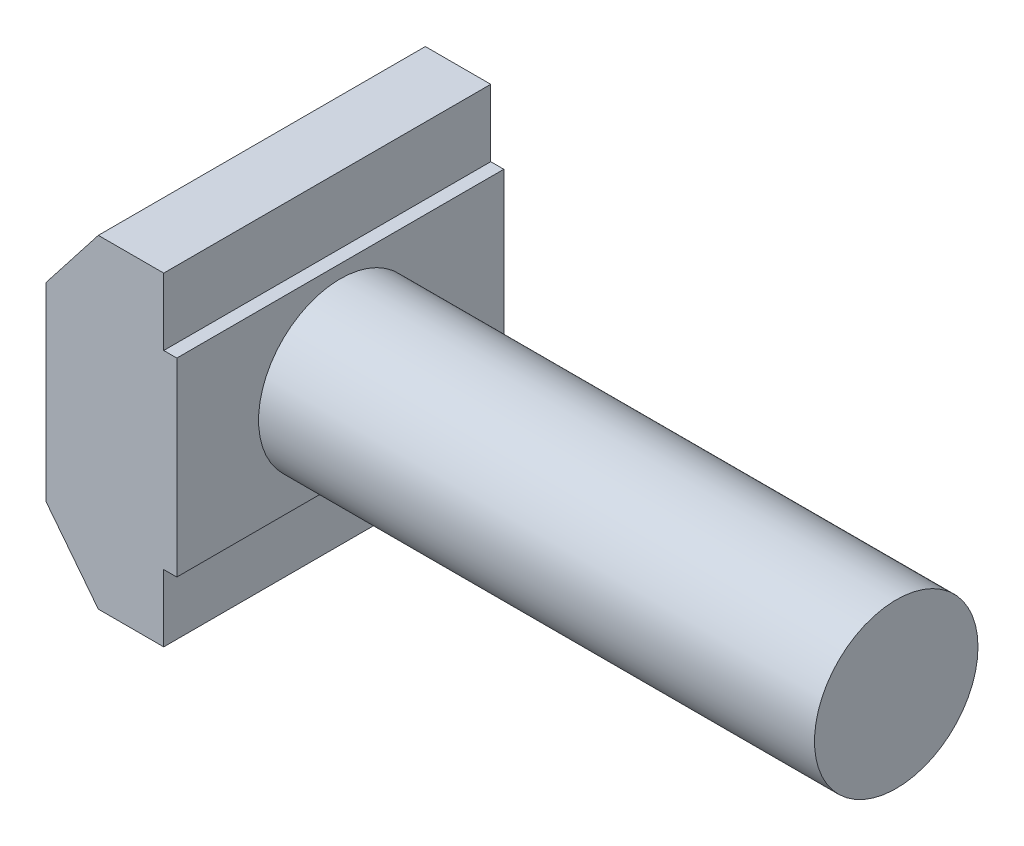
ISO-10303-21;
HEADER;
FILE_DESCRIPTION(('STEP AP214'),'2;1');
FILE_NAME('part.step','',(''),(''),'','','');
FILE_SCHEMA(('AUTOMOTIVE_DESIGN { 1 0 10303 214 1 1 1 1 }'));
ENDSEC;
DATA;
#1=APPLICATION_CONTEXT('core data for automotive mechanical design processes');
#2=APPLICATION_PROTOCOL_DEFINITION('international standard','automotive_design',2000,#1);
#3=PRODUCT_CONTEXT('',#1,'mechanical');
#4=PRODUCT('Part','Part','',(#3));
#5=PRODUCT_RELATED_PRODUCT_CATEGORY('part','',(#4));
#6=PRODUCT_DEFINITION_FORMATION('','',#4);
#7=PRODUCT_DEFINITION_CONTEXT('part definition',#1,'design');
#8=PRODUCT_DEFINITION('design','',#6,#7);
#9=PRODUCT_DEFINITION_SHAPE('','',#8);
#10=(LENGTH_UNIT() NAMED_UNIT(*) SI_UNIT(.MILLI.,.METRE.));
#11=(NAMED_UNIT(*) PLANE_ANGLE_UNIT() SI_UNIT($,.RADIAN.));
#12=(NAMED_UNIT(*) SI_UNIT($,.STERADIAN.) SOLID_ANGLE_UNIT());
#13=UNCERTAINTY_MEASURE_WITH_UNIT(LENGTH_MEASURE(1.E-05),#10,'distance_accuracy_value','');
#14=(GEOMETRIC_REPRESENTATION_CONTEXT(3) GLOBAL_UNCERTAINTY_ASSIGNED_CONTEXT((#13)) GLOBAL_UNIT_ASSIGNED_CONTEXT((#10,
#11,#12)) REPRESENTATION_CONTEXT('',''));
#15=CARTESIAN_POINT('',(0.,0.,0.));
#16=DIRECTION('',(0.,0.,1.));
#17=DIRECTION('',(1.,0.,0.));
#18=AXIS2_PLACEMENT_3D('',#15,#16,#17);
#19=CARTESIAN_POINT('',(0.,2.9,5.));
#20=DIRECTION('',(0.,-1.,0.));
#21=DIRECTION('',(0.,0.,-1.));
#22=AXIS2_PLACEMENT_3D('',#19,#20,#21);
#23=PLANE('',#22);
#24=DIRECTION('',(-1.,0.,0.));
#25=VECTOR('',#24,1.);
#26=CARTESIAN_POINT('',(0.,2.9,-5.));
#27=LINE('',#26,#25);
#28=CARTESIAN_POINT('',(0.,2.9,-5.));
#29=VERTEX_POINT('',#28);
#30=CARTESIAN_POINT('',(-0.400000000000023,2.9,-5.));
#31=VERTEX_POINT('',#30);
#32=EDGE_CURVE('E187',#29,#31,#27,.T.);
#33=ORIENTED_EDGE('',*,*,#32,.T.);
#34=DIRECTION('',(0.,0.,-1.));
#35=VECTOR('',#34,1.);
#36=CARTESIAN_POINT('',(-0.400000000000023,2.9,5.));
#37=LINE('',#36,#35);
#38=CARTESIAN_POINT('',(-0.400000000000023,2.9,5.));
#39=VERTEX_POINT('',#38);
#40=EDGE_CURVE('E55',#39,#31,#37,.T.);
#41=ORIENTED_EDGE('',*,*,#40,.F.);
#42=DIRECTION('',(-1.,0.,0.));
#43=VECTOR('',#42,1.);
#44=CARTESIAN_POINT('',(0.,2.9,5.));
#45=LINE('',#44,#43);
#46=CARTESIAN_POINT('',(0.,2.9,5.));
#47=VERTEX_POINT('',#46);
#48=EDGE_CURVE('E216',#47,#39,#45,.T.);
#49=ORIENTED_EDGE('',*,*,#48,.F.);
#50=DIRECTION('',(0.,0.,-1.));
#51=VECTOR('',#50,1.);
#52=CARTESIAN_POINT('',(0.,2.9,5.));
#53=LINE('',#52,#51);
#54=EDGE_CURVE('E183',#47,#29,#53,.T.);
#55=ORIENTED_EDGE('',*,*,#54,.T.);
#56=EDGE_LOOP('',(#33,#41,#49,#55));
#57=FACE_BOUND('',#56,.T.);
#58=ADVANCED_FACE('F52',(#57),#23,.F.);
#59=CARTESIAN_POINT('',(-0.400000000000023,2.9,5.));
#60=DIRECTION('',(-1.,0.,0.));
#61=DIRECTION('',(0.,-1.,0.));
#62=AXIS2_PLACEMENT_3D('',#59,#60,#61);
#63=PLANE('',#62);
#64=DIRECTION('',(0.,1.,0.));
#65=VECTOR('',#64,1.);
#66=CARTESIAN_POINT('',(-0.400000000000023,2.9,-5.));
#67=LINE('',#66,#65);
#68=CARTESIAN_POINT('',(-0.400000000000023,4.95,-5.));
#69=VERTEX_POINT('',#68);
#70=EDGE_CURVE('E191',#31,#69,#67,.T.);
#71=ORIENTED_EDGE('',*,*,#70,.T.);
#72=DIRECTION('',(0.,0.,-1.));
#73=VECTOR('',#72,1.);
#74=CARTESIAN_POINT('',(-0.400000000000023,4.95,5.));
#75=LINE('',#74,#73);
#76=CARTESIAN_POINT('',(-0.400000000000023,4.95,5.));
#77=VERTEX_POINT('',#76);
#78=EDGE_CURVE('E238',#77,#69,#75,.T.);
#79=ORIENTED_EDGE('',*,*,#78,.F.);
#80=DIRECTION('',(0.,1.,0.));
#81=VECTOR('',#80,1.);
#82=CARTESIAN_POINT('',(-0.400000000000023,2.9,5.));
#83=LINE('',#82,#81);
#84=EDGE_CURVE('E135',#39,#77,#83,.T.);
#85=ORIENTED_EDGE('',*,*,#84,.F.);
#86=ORIENTED_EDGE('',*,*,#40,.T.);
#87=EDGE_LOOP('',(#71,#79,#85,#86));
#88=FACE_BOUND('',#87,.T.);
#89=ADVANCED_FACE('F248',(#88),#63,.F.);
#90=CARTESIAN_POINT('',(-0.400000000000023,4.95,5.));
#91=DIRECTION('',(0.,-1.,0.));
#92=DIRECTION('',(0.,0.,-1.));
#93=AXIS2_PLACEMENT_3D('',#90,#91,#92);
#94=PLANE('',#93);
#95=DIRECTION('',(-1.,0.,0.));
#96=VECTOR('',#95,1.);
#97=CARTESIAN_POINT('',(-0.400000000000023,4.95,-5.));
#98=LINE('',#97,#96);
#99=CARTESIAN_POINT('',(-2.40000000000002,4.95,-5.));
#100=VERTEX_POINT('',#99);
#101=EDGE_CURVE('E195',#69,#100,#98,.T.);
#102=ORIENTED_EDGE('',*,*,#101,.T.);
#103=DIRECTION('',(0.,0.,-1.));
#104=VECTOR('',#103,1.);
#105=CARTESIAN_POINT('',(-2.40000000000002,4.95,5.));
#106=LINE('',#105,#104);
#107=CARTESIAN_POINT('',(-2.40000000000002,4.95,5.));
#108=VERTEX_POINT('',#107);
#109=EDGE_CURVE('E235',#108,#100,#106,.T.);
#110=ORIENTED_EDGE('',*,*,#109,.F.);
#111=DIRECTION('',(-1.,0.,0.));
#112=VECTOR('',#111,1.);
#113=CARTESIAN_POINT('',(-0.400000000000023,4.95,5.));
#114=LINE('',#113,#112);
#115=EDGE_CURVE('E266',#77,#108,#114,.T.);
#116=ORIENTED_EDGE('',*,*,#115,.F.);
#117=ORIENTED_EDGE('',*,*,#78,.T.);
#118=EDGE_LOOP('',(#102,#110,#116,#117));
#119=FACE_BOUND('',#118,.T.);
#120=ADVANCED_FACE('F257',(#119),#94,.F.);
#121=CARTESIAN_POINT('',(-2.40000000000002,4.95,5.));
#122=DIRECTION('',(0.788315783485076,-0.615270855402976,0.));
#123=DIRECTION('',(0.615270855402976,0.788315783485076,0.));
#124=AXIS2_PLACEMENT_3D('',#121,#122,#123);
#125=PLANE('',#124);
#126=DIRECTION('',(-0.615270855402976,-0.788315783485076,0.));
#127=VECTOR('',#126,1.);
#128=CARTESIAN_POINT('',(-2.40000000000002,4.95,-5.));
#129=LINE('',#128,#127);
#130=CARTESIAN_POINT('',(-4.,2.9,-5.));
#131=VERTEX_POINT('',#130);
#132=EDGE_CURVE('E198',#100,#131,#129,.T.);
#133=ORIENTED_EDGE('',*,*,#132,.T.);
#134=DIRECTION('',(0.,0.,-1.));
#135=VECTOR('',#134,1.);
#136=CARTESIAN_POINT('',(-4.,2.9,5.));
#137=LINE('',#136,#135);
#138=CARTESIAN_POINT('',(-4.,2.9,5.));
#139=VERTEX_POINT('',#138);
#140=EDGE_CURVE('E231',#139,#131,#137,.T.);
#141=ORIENTED_EDGE('',*,*,#140,.F.);
#142=DIRECTION('',(-0.615270855402976,-0.788315783485076,0.));
#143=VECTOR('',#142,1.);
#144=CARTESIAN_POINT('',(-2.40000000000002,4.95,5.));
#145=LINE('',#144,#143);
#146=EDGE_CURVE('E262',#108,#139,#145,.T.);
#147=ORIENTED_EDGE('',*,*,#146,.F.);
#148=ORIENTED_EDGE('',*,*,#109,.T.);
#149=EDGE_LOOP('',(#133,#141,#147,#148));
#150=FACE_BOUND('',#149,.T.);
#151=ADVANCED_FACE('F260',(#150),#125,.F.);
#152=CARTESIAN_POINT('',(-4.,-2.9,5.));
#153=DIRECTION('',(1.,0.,0.));
#154=DIRECTION('',(0.,0.,-1.));
#155=AXIS2_PLACEMENT_3D('',#152,#153,#154);
#156=PLANE('',#155);
#157=DIRECTION('',(0.,-1.,0.));
#158=VECTOR('',#157,1.);
#159=CARTESIAN_POINT('',(-4.,-2.9,-5.));
#160=LINE('',#159,#158);
#161=CARTESIAN_POINT('',(-4.,-2.9,-5.));
#162=VERTEX_POINT('',#161);
#163=EDGE_CURVE('E201',#131,#162,#160,.T.);
#164=ORIENTED_EDGE('',*,*,#163,.T.);
#165=DIRECTION('',(0.,0.,-1.));
#166=VECTOR('',#165,1.);
#167=CARTESIAN_POINT('',(-4.,-2.9,5.));
#168=LINE('',#167,#166);
#169=CARTESIAN_POINT('',(-4.,-2.9,5.));
#170=VERTEX_POINT('',#169);
#171=EDGE_CURVE('E227',#170,#162,#168,.T.);
#172=ORIENTED_EDGE('',*,*,#171,.F.);
#173=DIRECTION('',(0.,-1.,0.));
#174=VECTOR('',#173,1.);
#175=CARTESIAN_POINT('',(-4.,-2.9,5.));
#176=LINE('',#175,#174);
#177=EDGE_CURVE('E265',#139,#170,#176,.T.);
#178=ORIENTED_EDGE('',*,*,#177,.F.);
#179=ORIENTED_EDGE('',*,*,#140,.T.);
#180=EDGE_LOOP('',(#164,#172,#178,#179));
#181=FACE_BOUND('',#180,.T.);
#182=ADVANCED_FACE('F286',(#181),#156,.F.);
#183=CARTESIAN_POINT('',(-2.4,-4.95,5.));
#184=DIRECTION('',(0.788315783485071,0.615270855402983,0.));
#185=DIRECTION('',(-0.615270855402983,0.788315783485071,0.));
#186=AXIS2_PLACEMENT_3D('',#183,#184,#185);
#187=PLANE('',#186);
#188=DIRECTION('',(0.615270855402983,-0.788315783485071,0.));
#189=VECTOR('',#188,1.);
#190=CARTESIAN_POINT('',(-2.4,-4.95,-5.));
#191=LINE('',#190,#189);
#192=CARTESIAN_POINT('',(-2.4,-4.95,-5.));
#193=VERTEX_POINT('',#192);
#194=EDGE_CURVE('E204',#162,#193,#191,.T.);
#195=ORIENTED_EDGE('',*,*,#194,.T.);
#196=DIRECTION('',(0.,0.,-1.));
#197=VECTOR('',#196,1.);
#198=CARTESIAN_POINT('',(-2.4,-4.95,5.));
#199=LINE('',#198,#197);
#200=CARTESIAN_POINT('',(-2.4,-4.95,5.));
#201=VERTEX_POINT('',#200);
#202=EDGE_CURVE('E223',#201,#193,#199,.T.);
#203=ORIENTED_EDGE('',*,*,#202,.F.);
#204=DIRECTION('',(0.615270855402983,-0.788315783485071,0.));
#205=VECTOR('',#204,1.);
#206=CARTESIAN_POINT('',(-2.4,-4.95,5.));
#207=LINE('',#206,#205);
#208=EDGE_CURVE('E269',#170,#201,#207,.T.);
#209=ORIENTED_EDGE('',*,*,#208,.F.);
#210=ORIENTED_EDGE('',*,*,#171,.T.);
#211=EDGE_LOOP('',(#195,#203,#209,#210));
#212=FACE_BOUND('',#211,.T.);
#213=ADVANCED_FACE('F280',(#212),#187,.F.);
#214=CARTESIAN_POINT('',(-0.399999999999995,-4.95,5.));
#215=DIRECTION('',(0.,1.,0.));
#216=DIRECTION('',(0.,0.,1.));
#217=AXIS2_PLACEMENT_3D('',#214,#215,#216);
#218=PLANE('',#217);
#219=DIRECTION('',(1.,0.,0.));
#220=VECTOR('',#219,1.);
#221=CARTESIAN_POINT('',(-0.399999999999995,-4.95,-5.));
#222=LINE('',#221,#220);
#223=CARTESIAN_POINT('',(-0.399999999999995,-4.95,-5.));
#224=VERTEX_POINT('',#223);
#225=EDGE_CURVE('E207',#193,#224,#222,.T.);
#226=ORIENTED_EDGE('',*,*,#225,.T.);
#227=DIRECTION('',(0.,0.,-1.));
#228=VECTOR('',#227,1.);
#229=CARTESIAN_POINT('',(-0.399999999999995,-4.95,5.));
#230=LINE('',#229,#228);
#231=CARTESIAN_POINT('',(-0.399999999999995,-4.95,5.));
#232=VERTEX_POINT('',#231);
#233=EDGE_CURVE('E176',#232,#224,#230,.T.);
#234=ORIENTED_EDGE('',*,*,#233,.F.);
#235=DIRECTION('',(1.,0.,0.));
#236=VECTOR('',#235,1.);
#237=CARTESIAN_POINT('',(-0.399999999999995,-4.95,5.));
#238=LINE('',#237,#236);
#239=EDGE_CURVE('E165',#201,#232,#238,.T.);
#240=ORIENTED_EDGE('',*,*,#239,.F.);
#241=ORIENTED_EDGE('',*,*,#202,.T.);
#242=EDGE_LOOP('',(#226,#234,#240,#241));
#243=FACE_BOUND('',#242,.T.);
#244=ADVANCED_FACE('F284',(#243),#218,.F.);
#245=CARTESIAN_POINT('',(-0.399999999999995,-2.9,5.));
#246=DIRECTION('',(-1.,0.,0.));
#247=DIRECTION('',(0.,-1.,0.));
#248=AXIS2_PLACEMENT_3D('',#245,#246,#247);
#249=PLANE('',#248);
#250=DIRECTION('',(0.,1.,0.));
#251=VECTOR('',#250,1.);
#252=CARTESIAN_POINT('',(-0.399999999999995,-2.9,-5.));
#253=LINE('',#252,#251);
#254=CARTESIAN_POINT('',(-0.399999999999995,-2.9,-5.));
#255=VERTEX_POINT('',#254);
#256=EDGE_CURVE('E174',#224,#255,#253,.T.);
#257=ORIENTED_EDGE('',*,*,#256,.T.);
#258=DIRECTION('',(0.,0.,-1.));
#259=VECTOR('',#258,1.);
#260=CARTESIAN_POINT('',(-0.399999999999995,-2.9,5.));
#261=LINE('',#260,#259);
#262=CARTESIAN_POINT('',(-0.399999999999995,-2.9,5.));
#263=VERTEX_POINT('',#262);
#264=EDGE_CURVE('E171',#263,#255,#261,.T.);
#265=ORIENTED_EDGE('',*,*,#264,.F.);
#266=DIRECTION('',(0.,1.,0.));
#267=VECTOR('',#266,1.);
#268=CARTESIAN_POINT('',(-0.399999999999995,-2.9,5.));
#269=LINE('',#268,#267);
#270=EDGE_CURVE('E159',#232,#263,#269,.T.);
#271=ORIENTED_EDGE('',*,*,#270,.F.);
#272=ORIENTED_EDGE('',*,*,#233,.T.);
#273=EDGE_LOOP('',(#257,#265,#271,#272));
#274=FACE_BOUND('',#273,.T.);
#275=ADVANCED_FACE('F172',(#274),#249,.F.);
#276=CARTESIAN_POINT('',(0.,-2.9,5.));
#277=DIRECTION('',(0.,1.,0.));
#278=DIRECTION('',(0.,0.,1.));
#279=AXIS2_PLACEMENT_3D('',#276,#277,#278);
#280=PLANE('',#279);
#281=DIRECTION('',(1.,0.,0.));
#282=VECTOR('',#281,1.);
#283=CARTESIAN_POINT('',(0.,-2.9,-5.));
#284=LINE('',#283,#282);
#285=CARTESIAN_POINT('',(0.,-2.9,-5.));
#286=VERTEX_POINT('',#285);
#287=EDGE_CURVE('E118',#255,#286,#284,.T.);
#288=ORIENTED_EDGE('',*,*,#287,.T.);
#289=DIRECTION('',(0.,0.,-1.));
#290=VECTOR('',#289,1.);
#291=CARTESIAN_POINT('',(0.,-2.9,5.));
#292=LINE('',#291,#290);
#293=CARTESIAN_POINT('',(0.,-2.9,5.));
#294=VERTEX_POINT('',#293);
#295=EDGE_CURVE('E177',#294,#286,#292,.T.);
#296=ORIENTED_EDGE('',*,*,#295,.F.);
#297=DIRECTION('',(1.,0.,0.));
#298=VECTOR('',#297,1.);
#299=CARTESIAN_POINT('',(0.,-2.9,5.));
#300=LINE('',#299,#298);
#301=EDGE_CURVE('E163',#263,#294,#300,.T.);
#302=ORIENTED_EDGE('',*,*,#301,.F.);
#303=ORIENTED_EDGE('',*,*,#264,.T.);
#304=EDGE_LOOP('',(#288,#296,#302,#303));
#305=FACE_BOUND('',#304,.T.);
#306=ADVANCED_FACE('F179',(#305),#280,.F.);
#307=CARTESIAN_POINT('',(0.,-2.9,5.));
#308=DIRECTION('',(-1.,0.,0.));
#309=DIRECTION('',(0.,-1.,0.));
#310=AXIS2_PLACEMENT_3D('',#307,#308,#309);
#311=PLANE('',#310);
#312=CARTESIAN_POINT('',(0.,0.,0.));
#313=DIRECTION('',(1.,0.,0.));
#314=DIRECTION('',(0.,0.,-1.));
#315=AXIS2_PLACEMENT_3D('',#312,#313,#314);
#316=CIRCLE('',#315,2.5);
#317=CARTESIAN_POINT('',(0.,0.,-2.49999999999999));
#318=VERTEX_POINT('',#317);
#319=EDGE_CURVE('E13',#318,#318,#316,.T.);
#320=ORIENTED_EDGE('',*,*,#319,.F.);
#321=EDGE_LOOP('',(#320));
#322=FACE_BOUND('',#321,.T.);
#323=DIRECTION('',(0.,1.,0.));
#324=VECTOR('',#323,1.);
#325=CARTESIAN_POINT('',(0.,-2.9,-5.));
#326=LINE('',#325,#324);
#327=EDGE_CURVE('E125',#286,#29,#326,.T.);
#328=ORIENTED_EDGE('',*,*,#327,.T.);
#329=ORIENTED_EDGE('',*,*,#54,.F.);
#330=DIRECTION('',(0.,1.,0.));
#331=VECTOR('',#330,1.);
#332=CARTESIAN_POINT('',(0.,-2.9,5.));
#333=LINE('',#332,#331);
#334=EDGE_CURVE('E73',#294,#47,#333,.T.);
#335=ORIENTED_EDGE('',*,*,#334,.F.);
#336=ORIENTED_EDGE('',*,*,#295,.T.);
#337=EDGE_LOOP('',(#328,#329,#335,#336));
#338=FACE_BOUND('',#337,.T.);
#339=ADVANCED_FACE('F344',(#322,#338),#311,.F.);
#340=CARTESIAN_POINT('',(0.,0.,5.));
#341=DIRECTION('',(0.,0.,-1.));
#342=DIRECTION('',(-1.,0.,0.));
#343=AXIS2_PLACEMENT_3D('',#340,#341,#342);
#344=PLANE('',#343);
#345=ORIENTED_EDGE('',*,*,#48,.T.);
#346=ORIENTED_EDGE('',*,*,#84,.T.);
#347=ORIENTED_EDGE('',*,*,#115,.T.);
#348=ORIENTED_EDGE('',*,*,#146,.T.);
#349=ORIENTED_EDGE('',*,*,#177,.T.);
#350=ORIENTED_EDGE('',*,*,#208,.T.);
#351=ORIENTED_EDGE('',*,*,#239,.T.);
#352=ORIENTED_EDGE('',*,*,#270,.T.);
#353=ORIENTED_EDGE('',*,*,#301,.T.);
#354=ORIENTED_EDGE('',*,*,#334,.T.);
#355=EDGE_LOOP('',(#345,#346,#347,#348,#349,#350,#351,#352,#353,#354));
#356=FACE_BOUND('',#355,.T.);
#357=ADVANCED_FACE('F161',(#356),#344,.F.);
#358=CARTESIAN_POINT('',(0.,0.,-5.));
#359=DIRECTION('',(0.,0.,-1.));
#360=DIRECTION('',(-1.,0.,0.));
#361=AXIS2_PLACEMENT_3D('',#358,#359,#360);
#362=PLANE('',#361);
#363=ORIENTED_EDGE('',*,*,#32,.F.);
#364=ORIENTED_EDGE('',*,*,#327,.F.);
#365=ORIENTED_EDGE('',*,*,#287,.F.);
#366=ORIENTED_EDGE('',*,*,#256,.F.);
#367=ORIENTED_EDGE('',*,*,#225,.F.);
#368=ORIENTED_EDGE('',*,*,#194,.F.);
#369=ORIENTED_EDGE('',*,*,#163,.F.);
#370=ORIENTED_EDGE('',*,*,#132,.F.);
#371=ORIENTED_EDGE('',*,*,#101,.F.);
#372=ORIENTED_EDGE('',*,*,#70,.F.);
#373=EDGE_LOOP('',(#363,#364,#365,#366,#367,#368,#369,#370,#371,#372));
#374=FACE_BOUND('',#373,.T.);
#375=ADVANCED_FACE('F253',(#374),#362,.T.);
#376=CARTESIAN_POINT('',(17.,0.,0.));
#377=DIRECTION('',(-1.,0.,0.));
#378=DIRECTION('',(0.,0.,1.));
#379=AXIS2_PLACEMENT_3D('',#376,#377,#378);
#380=CYLINDRICAL_SURFACE('',#379,2.5);
#381=CARTESIAN_POINT('',(17.,0.,0.));
#382=DIRECTION('',(1.,0.,0.));
#383=DIRECTION('',(0.,0.,-1.));
#384=AXIS2_PLACEMENT_3D('',#381,#382,#383);
#385=CIRCLE('',#384,2.5);
#386=CARTESIAN_POINT('',(17.,0.,-2.49999999999999));
#387=VERTEX_POINT('',#386);
#388=EDGE_CURVE('E192',#387,#387,#385,.T.);
#389=ORIENTED_EDGE('',*,*,#388,.F.);
#390=EDGE_LOOP('',(#389));
#391=FACE_BOUND('',#390,.T.);
#392=ORIENTED_EDGE('',*,*,#319,.T.);
#393=EDGE_LOOP('',(#392));
#394=FACE_BOUND('',#393,.T.);
#395=ADVANCED_FACE('F365',(#391,#394),#380,.T.);
#396=CARTESIAN_POINT('',(17.,0.,0.));
#397=DIRECTION('',(1.,0.,0.));
#398=DIRECTION('',(0.,0.,-1.));
#399=AXIS2_PLACEMENT_3D('',#396,#397,#398);
#400=PLANE('',#399);
#401=ORIENTED_EDGE('',*,*,#388,.T.);
#402=EDGE_LOOP('',(#401));
#403=FACE_BOUND('',#402,.T.);
#404=ADVANCED_FACE('F380',(#403),#400,.T.);
#405=CLOSED_SHELL('',(#58,#89,#120,#151,#182,#213,#244,#275,#306,#339,#357,#375,#395,#404));
#406=MANIFOLD_SOLID_BREP('B2',#405);
#407=ADVANCED_BREP_SHAPE_REPRESENTATION('',(#18,#406),#14);
#408=SHAPE_DEFINITION_REPRESENTATION(#9,#407);
ENDSEC;
END-ISO-10303-21;
